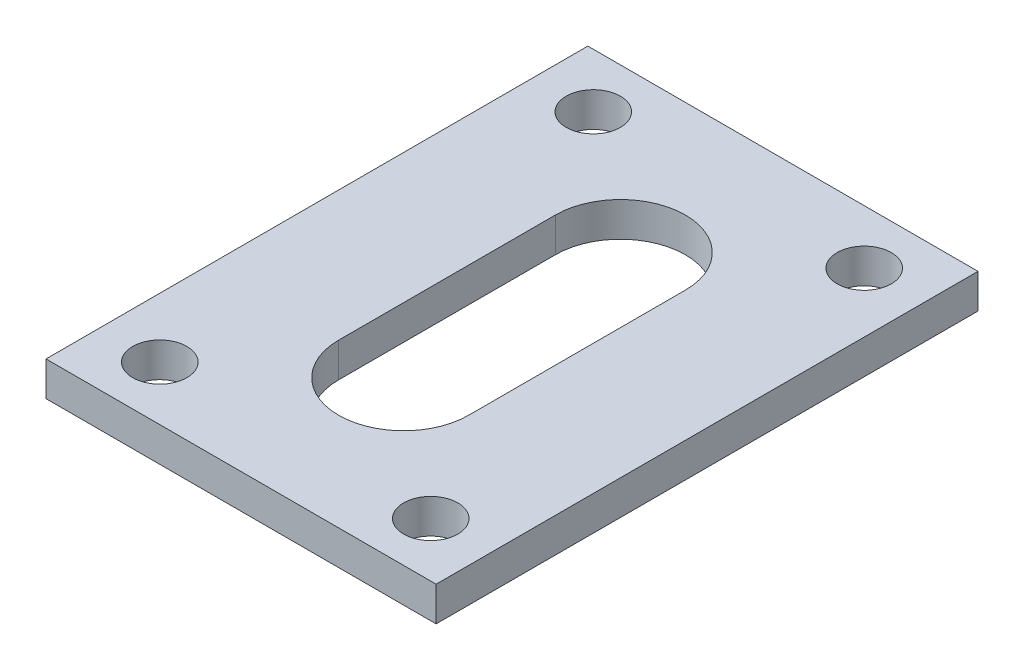
ISO-10303-21;
HEADER;
FILE_DESCRIPTION(('STEP AP214'),'2;1');
FILE_NAME('part.step','',(''),(''),'','','');
FILE_SCHEMA(('AUTOMOTIVE_DESIGN { 1 0 10303 214 1 1 1 1 }'));
ENDSEC;
DATA;
#1=APPLICATION_CONTEXT('core data for automotive mechanical design processes');
#2=APPLICATION_PROTOCOL_DEFINITION('international standard','automotive_design',2000,#1);
#3=PRODUCT_CONTEXT('',#1,'mechanical');
#4=PRODUCT('Part','Part','',(#3));
#5=PRODUCT_RELATED_PRODUCT_CATEGORY('part','',(#4));
#6=PRODUCT_DEFINITION_FORMATION('','',#4);
#7=PRODUCT_DEFINITION_CONTEXT('part definition',#1,'design');
#8=PRODUCT_DEFINITION('design','',#6,#7);
#9=PRODUCT_DEFINITION_SHAPE('','',#8);
#10=(LENGTH_UNIT() NAMED_UNIT(*) SI_UNIT(.MILLI.,.METRE.));
#11=(NAMED_UNIT(*) PLANE_ANGLE_UNIT() SI_UNIT($,.RADIAN.));
#12=(NAMED_UNIT(*) SI_UNIT($,.STERADIAN.) SOLID_ANGLE_UNIT());
#13=UNCERTAINTY_MEASURE_WITH_UNIT(LENGTH_MEASURE(1.E-05),#10,'distance_accuracy_value','');
#14=(GEOMETRIC_REPRESENTATION_CONTEXT(3) GLOBAL_UNCERTAINTY_ASSIGNED_CONTEXT((#13)) GLOBAL_UNIT_ASSIGNED_CONTEXT((#10,
#11,#12)) REPRESENTATION_CONTEXT('',''));
#15=CARTESIAN_POINT('',(0.,0.,0.));
#16=DIRECTION('',(0.,0.,1.));
#17=DIRECTION('',(1.,0.,0.));
#18=AXIS2_PLACEMENT_3D('',#15,#16,#17);
#19=CARTESIAN_POINT('',(18.0000000000003,3.17500000000021,-25.));
#20=DIRECTION('',(-1.,0.,0.));
#21=DIRECTION('',(0.,0.,1.));
#22=AXIS2_PLACEMENT_3D('',#19,#20,#21);
#23=PLANE('',#22);
#24=DIRECTION('',(0.,0.,-1.));
#25=VECTOR('',#24,1.);
#26=CARTESIAN_POINT('',(18.0000000000001,2.22044604925031E-13,-25.));
#27=LINE('',#26,#25);
#28=CARTESIAN_POINT('',(18.0000000000002,2.77555756156289E-13,25.));
#29=VERTEX_POINT('',#28);
#30=CARTESIAN_POINT('',(18.0000000000001,2.22044604925031E-13,-25.));
#31=VERTEX_POINT('',#30);
#32=EDGE_CURVE('E172',#29,#31,#27,.T.);
#33=ORIENTED_EDGE('',*,*,#32,.T.);
#34=DIRECTION('',(0.,-1.,0.));
#35=VECTOR('',#34,1.);
#36=CARTESIAN_POINT('',(18.0000000000003,3.17500000000021,-25.));
#37=LINE('',#36,#35);
#38=CARTESIAN_POINT('',(18.0000000000003,3.17500000000021,-25.));
#39=VERTEX_POINT('',#38);
#40=EDGE_CURVE('E13',#39,#31,#37,.T.);
#41=ORIENTED_EDGE('',*,*,#40,.F.);
#42=DIRECTION('',(0.,0.,-1.));
#43=VECTOR('',#42,1.);
#44=CARTESIAN_POINT('',(18.0000000000003,3.17500000000021,-25.));
#45=LINE('',#44,#43);
#46=CARTESIAN_POINT('',(18.0000000000003,3.17500000000021,25.));
#47=VERTEX_POINT('',#46);
#48=EDGE_CURVE('E173',#47,#39,#45,.T.);
#49=ORIENTED_EDGE('',*,*,#48,.F.);
#50=DIRECTION('',(0.,-1.,0.));
#51=VECTOR('',#50,1.);
#52=CARTESIAN_POINT('',(18.0000000000003,3.17500000000021,25.));
#53=LINE('',#52,#51);
#54=EDGE_CURVE('E183',#47,#29,#53,.T.);
#55=ORIENTED_EDGE('',*,*,#54,.T.);
#56=EDGE_LOOP('',(#33,#41,#49,#55));
#57=FACE_BOUND('',#56,.T.);
#58=ADVANCED_FACE('F48',(#57),#23,.F.);
#59=CARTESIAN_POINT('',(-17.9999999999997,3.17500000000015,-25.));
#60=DIRECTION('',(0.,0.,1.));
#61=DIRECTION('',(1.,0.,0.));
#62=AXIS2_PLACEMENT_3D('',#59,#60,#61);
#63=PLANE('',#62);
#64=DIRECTION('',(-1.,0.,0.));
#65=VECTOR('',#64,1.);
#66=CARTESIAN_POINT('',(-17.9999999999998,0.,-25.));
#67=LINE('',#66,#65);
#68=CARTESIAN_POINT('',(-17.9999999999998,0.,-25.));
#69=VERTEX_POINT('',#68);
#70=EDGE_CURVE('E186',#31,#69,#67,.T.);
#71=ORIENTED_EDGE('',*,*,#70,.T.);
#72=DIRECTION('',(0.,-1.,0.));
#73=VECTOR('',#72,1.);
#74=CARTESIAN_POINT('',(-17.9999999999997,3.17500000000015,-25.));
#75=LINE('',#74,#73);
#76=CARTESIAN_POINT('',(-17.9999999999997,3.17500000000015,-25.));
#77=VERTEX_POINT('',#76);
#78=EDGE_CURVE('E55',#77,#69,#75,.T.);
#79=ORIENTED_EDGE('',*,*,#78,.F.);
#80=DIRECTION('',(-1.,0.,0.));
#81=VECTOR('',#80,1.);
#82=CARTESIAN_POINT('',(-17.9999999999997,3.17500000000015,-25.));
#83=LINE('',#82,#81);
#84=EDGE_CURVE('E176',#39,#77,#83,.T.);
#85=ORIENTED_EDGE('',*,*,#84,.F.);
#86=ORIENTED_EDGE('',*,*,#40,.T.);
#87=EDGE_LOOP('',(#71,#79,#85,#86));
#88=FACE_BOUND('',#87,.T.);
#89=ADVANCED_FACE('F215',(#88),#63,.F.);
#90=CARTESIAN_POINT('',(-17.9999999999997,3.17500000000015,-25.));
#91=DIRECTION('',(1.,0.,0.));
#92=DIRECTION('',(0.,0.,-1.));
#93=AXIS2_PLACEMENT_3D('',#90,#91,#92);
#94=PLANE('',#93);
#95=DIRECTION('',(0.,0.,1.));
#96=VECTOR('',#95,1.);
#97=CARTESIAN_POINT('',(-17.9999999999998,0.,-25.));
#98=LINE('',#97,#96);
#99=CARTESIAN_POINT('',(-17.9999999999998,0.,25.));
#100=VERTEX_POINT('',#99);
#101=EDGE_CURVE('E188',#69,#100,#98,.T.);
#102=ORIENTED_EDGE('',*,*,#101,.T.);
#103=DIRECTION('',(0.,-1.,0.));
#104=VECTOR('',#103,1.);
#105=CARTESIAN_POINT('',(-17.9999999999997,3.17500000000015,25.));
#106=LINE('',#105,#104);
#107=CARTESIAN_POINT('',(-17.9999999999997,3.17500000000015,25.));
#108=VERTEX_POINT('',#107);
#109=EDGE_CURVE('E193',#108,#100,#106,.T.);
#110=ORIENTED_EDGE('',*,*,#109,.F.);
#111=DIRECTION('',(0.,0.,1.));
#112=VECTOR('',#111,1.);
#113=CARTESIAN_POINT('',(-17.9999999999997,3.17500000000015,-25.));
#114=LINE('',#113,#112);
#115=EDGE_CURVE('E179',#77,#108,#114,.T.);
#116=ORIENTED_EDGE('',*,*,#115,.F.);
#117=ORIENTED_EDGE('',*,*,#78,.T.);
#118=EDGE_LOOP('',(#102,#110,#116,#117));
#119=FACE_BOUND('',#118,.T.);
#120=ADVANCED_FACE('F200',(#119),#94,.F.);
#121=CARTESIAN_POINT('',(-17.9999999999997,3.17500000000015,25.));
#122=DIRECTION('',(0.,0.,-1.));
#123=DIRECTION('',(-1.,0.,0.));
#124=AXIS2_PLACEMENT_3D('',#121,#122,#123);
#125=PLANE('',#124);
#126=DIRECTION('',(1.,0.,0.));
#127=VECTOR('',#126,1.);
#128=CARTESIAN_POINT('',(-17.9999999999998,0.,25.));
#129=LINE('',#128,#127);
#130=EDGE_CURVE('E177',#100,#29,#129,.T.);
#131=ORIENTED_EDGE('',*,*,#130,.T.);
#132=ORIENTED_EDGE('',*,*,#54,.F.);
#133=DIRECTION('',(1.,0.,0.));
#134=VECTOR('',#133,1.);
#135=CARTESIAN_POINT('',(-17.9999999999997,3.17500000000015,25.));
#136=LINE('',#135,#134);
#137=EDGE_CURVE('E181',#108,#47,#136,.T.);
#138=ORIENTED_EDGE('',*,*,#137,.F.);
#139=ORIENTED_EDGE('',*,*,#109,.T.);
#140=EDGE_LOOP('',(#131,#132,#138,#139));
#141=FACE_BOUND('',#140,.T.);
#142=ADVANCED_FACE('F208',(#141),#125,.F.);
#143=CARTESIAN_POINT('',(0.,3.17499999999998,0.));
#144=DIRECTION('',(0.,1.,0.));
#145=DIRECTION('',(0.,0.,1.));
#146=AXIS2_PLACEMENT_3D('',#143,#144,#145);
#147=PLANE('',#146);
#148=CARTESIAN_POINT('',(0.,3.17499999999998,10.));
#149=DIRECTION('',(0.,1.,0.));
#150=DIRECTION('',(0.,0.,1.));
#151=AXIS2_PLACEMENT_3D('',#148,#149,#150);
#152=CIRCLE('',#151,6.);
#153=CARTESIAN_POINT('',(-5.99999999999981,3.17500000000015,10.));
#154=VERTEX_POINT('',#153);
#155=CARTESIAN_POINT('',(6.0000000000002,3.17500000000009,10.));
#156=VERTEX_POINT('',#155);
#157=EDGE_CURVE('E62',#154,#156,#152,.T.);
#158=ORIENTED_EDGE('',*,*,#157,.F.);
#159=DIRECTION('',(0.,0.,1.));
#160=VECTOR('',#159,1.);
#161=CARTESIAN_POINT('',(-5.99999999999981,3.17500000000015,10.));
#162=LINE('',#161,#160);
#163=CARTESIAN_POINT('',(-5.99999999999981,3.17500000000015,-10.));
#164=VERTEX_POINT('',#163);
#165=EDGE_CURVE('E120',#164,#154,#162,.T.);
#166=ORIENTED_EDGE('',*,*,#165,.F.);
#167=CARTESIAN_POINT('',(0.,3.17499999999998,-10.));
#168=DIRECTION('',(0.,1.,0.));
#169=DIRECTION('',(0.,0.,1.));
#170=AXIS2_PLACEMENT_3D('',#167,#168,#169);
#171=CIRCLE('',#170,6.);
#172=CARTESIAN_POINT('',(6.00000000000028,3.17500000000015,-10.));
#173=VERTEX_POINT('',#172);
#174=EDGE_CURVE('E140',#173,#164,#171,.T.);
#175=ORIENTED_EDGE('',*,*,#174,.F.);
#176=DIRECTION('',(0.,0.,-1.));
#177=VECTOR('',#176,1.);
#178=CARTESIAN_POINT('',(6.0000000000002,3.17500000000009,10.));
#179=LINE('',#178,#177);
#180=EDGE_CURVE('E134',#156,#173,#179,.T.);
#181=ORIENTED_EDGE('',*,*,#180,.F.);
#182=EDGE_LOOP('',(#158,#166,#175,#181));
#183=FACE_BOUND('',#182,.T.);
#184=CARTESIAN_POINT('',(-12.4999999999997,3.17499999999998,20.));
#185=DIRECTION('',(0.,1.,0.));
#186=DIRECTION('',(0.,0.,1.));
#187=AXIS2_PLACEMENT_3D('',#184,#185,#186);
#188=CIRCLE('',#187,2.5);
#189=CARTESIAN_POINT('',(-12.4999999999997,3.17499999999998,22.5));
#190=VERTEX_POINT('',#189);
#191=EDGE_CURVE('E126',#190,#190,#188,.T.);
#192=ORIENTED_EDGE('',*,*,#191,.F.);
#193=EDGE_LOOP('',(#192));
#194=FACE_BOUND('',#193,.T.);
#195=CARTESIAN_POINT('',(12.5000000000001,3.17500000000015,20.));
#196=DIRECTION('',(0.,1.,0.));
#197=DIRECTION('',(0.,0.,1.));
#198=AXIS2_PLACEMENT_3D('',#195,#196,#197);
#199=CIRCLE('',#198,2.5);
#200=CARTESIAN_POINT('',(12.5000000000001,3.17500000000015,22.5));
#201=VERTEX_POINT('',#200);
#202=EDGE_CURVE('E157',#201,#201,#199,.T.);
#203=ORIENTED_EDGE('',*,*,#202,.F.);
#204=EDGE_LOOP('',(#203));
#205=FACE_BOUND('',#204,.T.);
#206=CARTESIAN_POINT('',(12.5000000000002,3.17500000000021,-20.));
#207=DIRECTION('',(0.,1.,0.));
#208=DIRECTION('',(0.,0.,1.));
#209=AXIS2_PLACEMENT_3D('',#206,#207,#208);
#210=CIRCLE('',#209,2.5);
#211=CARTESIAN_POINT('',(12.5000000000002,3.1750000000002,-17.5));
#212=VERTEX_POINT('',#211);
#213=EDGE_CURVE('E149',#212,#212,#210,.T.);
#214=ORIENTED_EDGE('',*,*,#213,.F.);
#215=EDGE_LOOP('',(#214));
#216=FACE_BOUND('',#215,.T.);
#217=CARTESIAN_POINT('',(-12.4999999999997,3.17499999999998,-20.));
#218=DIRECTION('',(0.,1.,0.));
#219=DIRECTION('',(0.,0.,1.));
#220=AXIS2_PLACEMENT_3D('',#217,#218,#219);
#221=CIRCLE('',#220,2.5);
#222=CARTESIAN_POINT('',(-12.4999999999997,3.17499999999998,-17.5));
#223=VERTEX_POINT('',#222);
#224=EDGE_CURVE('E156',#223,#223,#221,.T.);
#225=ORIENTED_EDGE('',*,*,#224,.F.);
#226=EDGE_LOOP('',(#225));
#227=FACE_BOUND('',#226,.T.);
#228=ORIENTED_EDGE('',*,*,#48,.T.);
#229=ORIENTED_EDGE('',*,*,#84,.T.);
#230=ORIENTED_EDGE('',*,*,#115,.T.);
#231=ORIENTED_EDGE('',*,*,#137,.T.);
#232=EDGE_LOOP('',(#228,#229,#230,#231));
#233=FACE_BOUND('',#232,.T.);
#234=ADVANCED_FACE('F214',(#183,#194,#205,#216,#227,#233),#147,.T.);
#235=CARTESIAN_POINT('',(0.,0.,0.));
#236=DIRECTION('',(0.,1.,0.));
#237=DIRECTION('',(0.,0.,1.));
#238=AXIS2_PLACEMENT_3D('',#235,#236,#237);
#239=PLANE('',#238);
#240=DIRECTION('',(0.,0.,-1.));
#241=VECTOR('',#240,1.);
#242=CARTESIAN_POINT('',(-5.99999999999992,1.11022302462516E-13,10.));
#243=LINE('',#242,#241);
#244=CARTESIAN_POINT('',(-5.99999999999992,1.11022302462516E-13,10.));
#245=VERTEX_POINT('',#244);
#246=CARTESIAN_POINT('',(-5.99999999999989,1.11022302462516E-13,-10.));
#247=VERTEX_POINT('',#246);
#248=EDGE_CURVE('E132',#245,#247,#243,.T.);
#249=ORIENTED_EDGE('',*,*,#248,.F.);
#250=CARTESIAN_POINT('',(0.,0.,10.));
#251=DIRECTION('',(0.,1.,0.));
#252=DIRECTION('',(0.,0.,1.));
#253=AXIS2_PLACEMENT_3D('',#250,#251,#252);
#254=CIRCLE('',#253,6.);
#255=CARTESIAN_POINT('',(6.00000000000014,2.77555756156289E-13,10.));
#256=VERTEX_POINT('',#255);
#257=EDGE_CURVE('E114',#256,#245,#254,.F.);
#258=ORIENTED_EDGE('',*,*,#257,.F.);
#259=DIRECTION('',(0.,0.,1.));
#260=VECTOR('',#259,1.);
#261=CARTESIAN_POINT('',(6.00000000000014,2.77555756156289E-13,10.));
#262=LINE('',#261,#260);
#263=CARTESIAN_POINT('',(6.00000000000014,2.22044604925031E-13,-10.));
#264=VERTEX_POINT('',#263);
#265=EDGE_CURVE('E123',#264,#256,#262,.T.);
#266=ORIENTED_EDGE('',*,*,#265,.F.);
#267=CARTESIAN_POINT('',(0.,0.,-10.));
#268=DIRECTION('',(0.,1.,0.));
#269=DIRECTION('',(0.,0.,1.));
#270=AXIS2_PLACEMENT_3D('',#267,#268,#269);
#271=CIRCLE('',#270,6.);
#272=EDGE_CURVE('E70',#247,#264,#271,.F.);
#273=ORIENTED_EDGE('',*,*,#272,.F.);
#274=EDGE_LOOP('',(#249,#258,#266,#273));
#275=FACE_BOUND('',#274,.T.);
#276=CARTESIAN_POINT('',(-12.4999999999999,0.,20.));
#277=DIRECTION('',(0.,1.,0.));
#278=DIRECTION('',(0.,0.,1.));
#279=AXIS2_PLACEMENT_3D('',#276,#277,#278);
#280=CIRCLE('',#279,2.5);
#281=CARTESIAN_POINT('',(-12.4999999999999,0.,22.5));
#282=VERTEX_POINT('',#281);
#283=EDGE_CURVE('E160',#282,#282,#280,.F.);
#284=ORIENTED_EDGE('',*,*,#283,.F.);
#285=EDGE_LOOP('',(#284));
#286=FACE_BOUND('',#285,.T.);
#287=CARTESIAN_POINT('',(12.5000000000001,1.11022302462516E-13,20.));
#288=DIRECTION('',(0.,1.,0.));
#289=DIRECTION('',(0.,0.,1.));
#290=AXIS2_PLACEMENT_3D('',#287,#288,#289);
#291=CIRCLE('',#290,2.5);
#292=CARTESIAN_POINT('',(12.5000000000001,1.10050857315969E-13,22.5));
#293=VERTEX_POINT('',#292);
#294=EDGE_CURVE('E153',#293,#293,#291,.F.);
#295=ORIENTED_EDGE('',*,*,#294,.F.);
#296=EDGE_LOOP('',(#295));
#297=FACE_BOUND('',#296,.T.);
#298=CARTESIAN_POINT('',(12.5000000000001,1.11022302462516E-13,-20.));
#299=DIRECTION('',(0.,1.,0.));
#300=DIRECTION('',(0.,0.,1.));
#301=AXIS2_PLACEMENT_3D('',#298,#299,#300);
#302=CIRCLE('',#301,2.5);
#303=CARTESIAN_POINT('',(12.5000000000001,1.10050857315969E-13,-17.5));
#304=VERTEX_POINT('',#303);
#305=EDGE_CURVE('E152',#304,#304,#302,.F.);
#306=ORIENTED_EDGE('',*,*,#305,.F.);
#307=EDGE_LOOP('',(#306));
#308=FACE_BOUND('',#307,.T.);
#309=CARTESIAN_POINT('',(-12.4999999999998,1.11022302462516E-13,-20.));
#310=DIRECTION('',(0.,1.,0.));
#311=DIRECTION('',(0.,0.,1.));
#312=AXIS2_PLACEMENT_3D('',#309,#310,#311);
#313=CIRCLE('',#312,2.5);
#314=CARTESIAN_POINT('',(-12.4999999999998,1.10050857315969E-13,-17.5));
#315=VERTEX_POINT('',#314);
#316=EDGE_CURVE('E169',#315,#315,#313,.F.);
#317=ORIENTED_EDGE('',*,*,#316,.F.);
#318=EDGE_LOOP('',(#317));
#319=FACE_BOUND('',#318,.T.);
#320=ORIENTED_EDGE('',*,*,#32,.F.);
#321=ORIENTED_EDGE('',*,*,#130,.F.);
#322=ORIENTED_EDGE('',*,*,#101,.F.);
#323=ORIENTED_EDGE('',*,*,#70,.F.);
#324=EDGE_LOOP('',(#320,#321,#322,#323));
#325=FACE_BOUND('',#324,.T.);
#326=ADVANCED_FACE('F129',(#275,#286,#297,#308,#319,#325),#239,.F.);
#327=CARTESIAN_POINT('',(-12.4999999999997,-0.000999999999806711,-20.));
#328=DIRECTION('',(0.,1.,0.));
#329=DIRECTION('',(0.,0.,1.));
#330=AXIS2_PLACEMENT_3D('',#327,#328,#329);
#331=CYLINDRICAL_SURFACE('',#330,2.5);
#332=ORIENTED_EDGE('',*,*,#224,.T.);
#333=EDGE_LOOP('',(#332));
#334=FACE_BOUND('',#333,.T.);
#335=ORIENTED_EDGE('',*,*,#316,.T.);
#336=EDGE_LOOP('',(#335));
#337=FACE_BOUND('',#336,.T.);
#338=ADVANCED_FACE('F227',(#334,#337),#331,.F.);
#339=CARTESIAN_POINT('',(12.5000000000002,-0.00100000000002876,-20.));
#340=DIRECTION('',(0.,1.,0.));
#341=DIRECTION('',(0.,0.,1.));
#342=AXIS2_PLACEMENT_3D('',#339,#340,#341);
#343=CYLINDRICAL_SURFACE('',#342,2.5);
#344=ORIENTED_EDGE('',*,*,#213,.T.);
#345=EDGE_LOOP('',(#344));
#346=FACE_BOUND('',#345,.T.);
#347=ORIENTED_EDGE('',*,*,#305,.T.);
#348=EDGE_LOOP('',(#347));
#349=FACE_BOUND('',#348,.T.);
#350=ADVANCED_FACE('F233',(#346,#349),#343,.F.);
#351=CARTESIAN_POINT('',(12.5,-0.00100000000002876,20.));
#352=DIRECTION('',(0.,1.,0.));
#353=DIRECTION('',(0.,0.,1.));
#354=AXIS2_PLACEMENT_3D('',#351,#352,#353);
#355=CYLINDRICAL_SURFACE('',#354,2.5);
#356=ORIENTED_EDGE('',*,*,#202,.T.);
#357=EDGE_LOOP('',(#356));
#358=FACE_BOUND('',#357,.T.);
#359=ORIENTED_EDGE('',*,*,#294,.T.);
#360=EDGE_LOOP('',(#359));
#361=FACE_BOUND('',#360,.T.);
#362=ADVANCED_FACE('F238',(#358,#361),#355,.F.);
#363=CARTESIAN_POINT('',(-12.4999999999999,-0.000999999999973245,20.));
#364=DIRECTION('',(0.,1.,0.));
#365=DIRECTION('',(0.,0.,1.));
#366=AXIS2_PLACEMENT_3D('',#363,#364,#365);
#367=CYLINDRICAL_SURFACE('',#366,2.5);
#368=ORIENTED_EDGE('',*,*,#191,.T.);
#369=EDGE_LOOP('',(#368));
#370=FACE_BOUND('',#369,.T.);
#371=ORIENTED_EDGE('',*,*,#283,.T.);
#372=EDGE_LOOP('',(#371));
#373=FACE_BOUND('',#372,.T.);
#374=ADVANCED_FACE('F235',(#370,#373),#367,.F.);
#375=CARTESIAN_POINT('',(1.11022302462516E-13,-0.000999999999973245,10.));
#376=DIRECTION('',(0.,1.,0.));
#377=DIRECTION('',(0.,0.,1.));
#378=AXIS2_PLACEMENT_3D('',#375,#376,#377);
#379=CYLINDRICAL_SURFACE('',#378,6.);
#380=ORIENTED_EDGE('',*,*,#257,.T.);
#381=DIRECTION('',(0.,1.,0.));
#382=VECTOR('',#381,1.);
#383=CARTESIAN_POINT('',(-5.9999999999998,-0.000999999999806711,10.));
#384=LINE('',#383,#382);
#385=EDGE_CURVE('E127',#245,#154,#384,.T.);
#386=ORIENTED_EDGE('',*,*,#385,.T.);
#387=ORIENTED_EDGE('',*,*,#157,.T.);
#388=DIRECTION('',(0.,1.,0.));
#389=VECTOR('',#388,1.);
#390=CARTESIAN_POINT('',(6.00000000000014,-0.000999999999862222,10.));
#391=LINE('',#390,#389);
#392=EDGE_CURVE('E110',#256,#156,#391,.T.);
#393=ORIENTED_EDGE('',*,*,#392,.F.);
#394=EDGE_LOOP('',(#380,#386,#387,#393));
#395=FACE_BOUND('',#394,.T.);
#396=ADVANCED_FACE('F112',(#395),#379,.F.);
#397=CARTESIAN_POINT('',(-5.9999999999998,-0.000999999999806711,10.));
#398=DIRECTION('',(-1.,0.,0.));
#399=DIRECTION('',(0.,0.,1.));
#400=AXIS2_PLACEMENT_3D('',#397,#398,#399);
#401=PLANE('',#400);
#402=ORIENTED_EDGE('',*,*,#248,.T.);
#403=DIRECTION('',(0.,1.,0.));
#404=VECTOR('',#403,1.);
#405=CARTESIAN_POINT('',(-5.99999999999976,-0.000999999999806711,-10.));
#406=LINE('',#405,#404);
#407=EDGE_CURVE('E146',#247,#164,#406,.T.);
#408=ORIENTED_EDGE('',*,*,#407,.T.);
#409=ORIENTED_EDGE('',*,*,#165,.T.);
#410=ORIENTED_EDGE('',*,*,#385,.F.);
#411=EDGE_LOOP('',(#402,#408,#409,#410));
#412=FACE_BOUND('',#411,.T.);
#413=ADVANCED_FACE('F248',(#412),#401,.F.);
#414=CARTESIAN_POINT('',(2.4980018054066E-13,-0.000999999999973245,-10.));
#415=DIRECTION('',(0.,1.,0.));
#416=DIRECTION('',(0.,0.,1.));
#417=AXIS2_PLACEMENT_3D('',#414,#415,#416);
#418=CYLINDRICAL_SURFACE('',#417,6.);
#419=ORIENTED_EDGE('',*,*,#272,.T.);
#420=DIRECTION('',(0.,1.,0.));
#421=VECTOR('',#420,1.);
#422=CARTESIAN_POINT('',(6.00000000000014,-0.000999999999862222,-10.));
#423=LINE('',#422,#421);
#424=EDGE_CURVE('E119',#264,#173,#423,.T.);
#425=ORIENTED_EDGE('',*,*,#424,.T.);
#426=ORIENTED_EDGE('',*,*,#174,.T.);
#427=ORIENTED_EDGE('',*,*,#407,.F.);
#428=EDGE_LOOP('',(#419,#425,#426,#427));
#429=FACE_BOUND('',#428,.T.);
#430=ADVANCED_FACE('F251',(#429),#418,.F.);
#431=CARTESIAN_POINT('',(6.00000000000014,-0.000999999999862222,10.));
#432=DIRECTION('',(1.,0.,0.));
#433=DIRECTION('',(0.,0.,-1.));
#434=AXIS2_PLACEMENT_3D('',#431,#432,#433);
#435=PLANE('',#434);
#436=ORIENTED_EDGE('',*,*,#265,.T.);
#437=ORIENTED_EDGE('',*,*,#392,.T.);
#438=ORIENTED_EDGE('',*,*,#180,.T.);
#439=ORIENTED_EDGE('',*,*,#424,.F.);
#440=EDGE_LOOP('',(#436,#437,#438,#439));
#441=FACE_BOUND('',#440,.T.);
#442=ADVANCED_FACE('F124',(#441),#435,.F.);
#443=CLOSED_SHELL('',(#58,#89,#120,#142,#234,#326,#338,#350,#362,#374,#396,#413,#430,#442));
#444=MANIFOLD_SOLID_BREP('B2',#443);
#445=ADVANCED_BREP_SHAPE_REPRESENTATION('',(#18,#444),#14);
#446=SHAPE_DEFINITION_REPRESENTATION(#9,#445);
ENDSEC;
END-ISO-10303-21;
